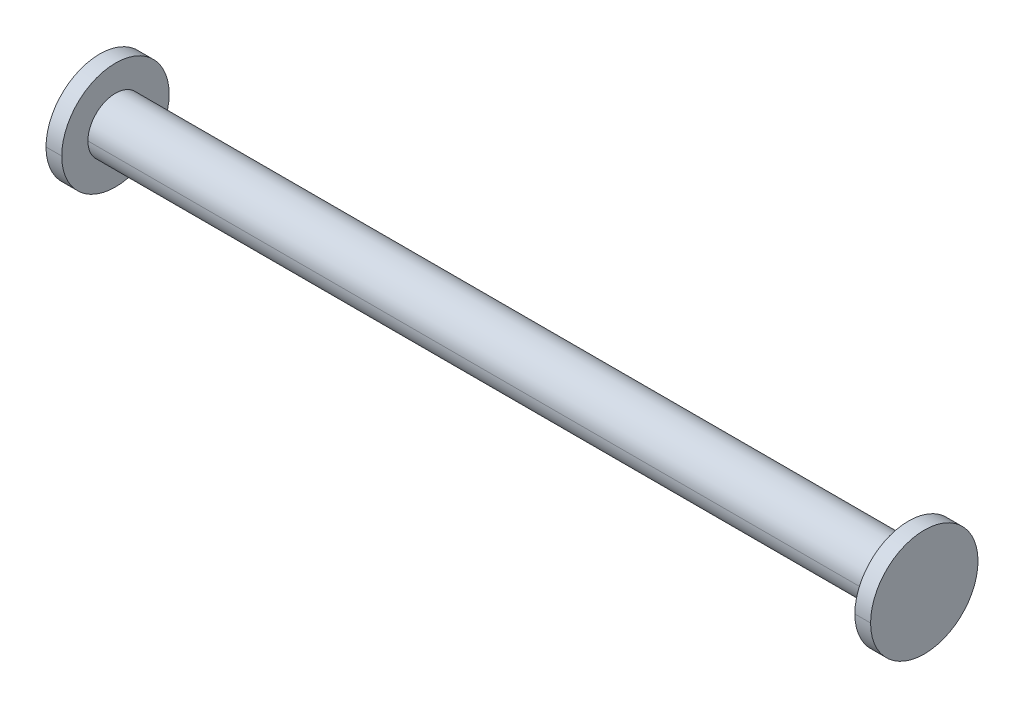
ISO-10303-21;
HEADER;
FILE_DESCRIPTION(('STEP AP214'),'2;1');
FILE_NAME('part.step','',(''),(''),'','','');
FILE_SCHEMA(('AUTOMOTIVE_DESIGN { 1 0 10303 214 1 1 1 1 }'));
ENDSEC;
DATA;
#1=APPLICATION_CONTEXT('core data for automotive mechanical design processes');
#2=APPLICATION_PROTOCOL_DEFINITION('international standard','automotive_design',2000,#1);
#3=PRODUCT_CONTEXT('',#1,'mechanical');
#4=PRODUCT('Part','Part','',(#3));
#5=PRODUCT_RELATED_PRODUCT_CATEGORY('part','',(#4));
#6=PRODUCT_DEFINITION_FORMATION('','',#4);
#7=PRODUCT_DEFINITION_CONTEXT('part definition',#1,'design');
#8=PRODUCT_DEFINITION('design','',#6,#7);
#9=PRODUCT_DEFINITION_SHAPE('','',#8);
#10=(LENGTH_UNIT() NAMED_UNIT(*) SI_UNIT(.MILLI.,.METRE.));
#11=(NAMED_UNIT(*) PLANE_ANGLE_UNIT() SI_UNIT($,.RADIAN.));
#12=(NAMED_UNIT(*) SI_UNIT($,.STERADIAN.) SOLID_ANGLE_UNIT());
#13=UNCERTAINTY_MEASURE_WITH_UNIT(LENGTH_MEASURE(1.E-05),#10,'distance_accuracy_value','');
#14=(GEOMETRIC_REPRESENTATION_CONTEXT(3) GLOBAL_UNCERTAINTY_ASSIGNED_CONTEXT((#13)) GLOBAL_UNIT_ASSIGNED_CONTEXT((#10,
#11,#12)) REPRESENTATION_CONTEXT('',''));
#15=CARTESIAN_POINT('',(0.,0.,0.));
#16=DIRECTION('',(0.,0.,1.));
#17=DIRECTION('',(1.,0.,0.));
#18=AXIS2_PLACEMENT_3D('',#15,#16,#17);
#19=CARTESIAN_POINT('',(59.4190666666667,0.,0.));
#20=DIRECTION('',(-1.,0.,0.));
#21=DIRECTION('',(0.,0.,1.));
#22=AXIS2_PLACEMENT_3D('',#19,#20,#21);
#23=PLANE('',#22);
#24=CARTESIAN_POINT('',(59.4190666666667,0.,0.));
#25=DIRECTION('',(1.,0.,0.));
#26=DIRECTION('',(0.,0.,-1.));
#27=AXIS2_PLACEMENT_3D('',#24,#25,#26);
#28=CIRCLE('',#27,7.73906249999998);
#29=CARTESIAN_POINT('',(59.4190666666667,0.,-7.73906249999998));
#30=VERTEX_POINT('',#29);
#31=CARTESIAN_POINT('',(59.4190666666667,0.,7.73906249999998));
#32=VERTEX_POINT('',#31);
#33=EDGE_CURVE('E139',#30,#32,#28,.T.);
#34=ORIENTED_EDGE('',*,*,#33,.T.);
#35=CARTESIAN_POINT('',(59.4190666666667,0.,0.));
#36=DIRECTION('',(1.,0.,0.));
#37=DIRECTION('',(0.,0.,-1.));
#38=AXIS2_PLACEMENT_3D('',#35,#36,#37);
#39=CIRCLE('',#38,7.73906249999998);
#40=EDGE_CURVE('E11',#32,#30,#39,.T.);
#41=ORIENTED_EDGE('',*,*,#40,.T.);
#42=EDGE_LOOP('',(#34,#41));
#43=FACE_BOUND('',#42,.T.);
#44=ADVANCED_FACE('F49',(#43),#23,.F.);
#45=CARTESIAN_POINT('',(24.5661814705045,0.,0.));
#46=DIRECTION('',(1.,0.,0.));
#47=DIRECTION('',(0.,0.,-1.));
#48=AXIS2_PLACEMENT_3D('',#45,#46,#47);
#49=CYLINDRICAL_SURFACE('',#48,7.73906249999999);
#50=DIRECTION('',(1.,0.,0.));
#51=VECTOR('',#50,1.);
#52=CARTESIAN_POINT('',(24.5661814705045,0.,7.73906249999999));
#53=LINE('',#52,#51);
#54=CARTESIAN_POINT('',(57.15,0.,7.73906249999999));
#55=VERTEX_POINT('',#54);
#56=EDGE_CURVE('E133',#55,#32,#53,.T.);
#57=ORIENTED_EDGE('',*,*,#56,.F.);
#58=CARTESIAN_POINT('',(57.15,0.,0.));
#59=DIRECTION('',(1.,0.,0.));
#60=DIRECTION('',(0.,0.,-1.));
#61=AXIS2_PLACEMENT_3D('',#58,#59,#60);
#62=CIRCLE('',#61,7.73906249999999);
#63=CARTESIAN_POINT('',(57.15,0.,-7.73906249999999));
#64=VERTEX_POINT('',#63);
#65=EDGE_CURVE('E58',#55,#64,#62,.T.);
#66=ORIENTED_EDGE('',*,*,#65,.T.);
#67=DIRECTION('',(1.,0.,0.));
#68=VECTOR('',#67,1.);
#69=CARTESIAN_POINT('',(24.5661814705045,0.,-7.73906249999999));
#70=LINE('',#69,#68);
#71=EDGE_CURVE('E142',#64,#30,#70,.T.);
#72=ORIENTED_EDGE('',*,*,#71,.T.);
#73=ORIENTED_EDGE('',*,*,#40,.F.);
#74=EDGE_LOOP('',(#57,#66,#72,#73));
#75=FACE_BOUND('',#74,.T.);
#76=ADVANCED_FACE('F134',(#75),#49,.T.);
#77=CARTESIAN_POINT('',(57.15,0.,0.));
#78=DIRECTION('',(1.,0.,0.));
#79=DIRECTION('',(0.,1.,0.));
#80=AXIS2_PLACEMENT_3D('',#77,#78,#79);
#81=PLANE('',#80);
#82=CARTESIAN_POINT('',(57.15,0.,0.));
#83=DIRECTION('',(1.,0.,0.));
#84=DIRECTION('',(0.,0.,-1.));
#85=AXIS2_PLACEMENT_3D('',#82,#83,#84);
#86=CIRCLE('',#85,3.96875);
#87=CARTESIAN_POINT('',(57.15,0.,-3.96875));
#88=VERTEX_POINT('',#87);
#89=CARTESIAN_POINT('',(57.15,0.,3.96875));
#90=VERTEX_POINT('',#89);
#91=EDGE_CURVE('E153',#88,#90,#86,.T.);
#92=ORIENTED_EDGE('',*,*,#91,.T.);
#93=CARTESIAN_POINT('',(57.15,0.,0.));
#94=DIRECTION('',(1.,0.,0.));
#95=DIRECTION('',(0.,0.,-1.));
#96=AXIS2_PLACEMENT_3D('',#93,#94,#95);
#97=CIRCLE('',#96,3.96875);
#98=EDGE_CURVE('E69',#90,#88,#97,.T.);
#99=ORIENTED_EDGE('',*,*,#98,.T.);
#100=EDGE_LOOP('',(#92,#99));
#101=FACE_BOUND('',#100,.T.);
#102=CARTESIAN_POINT('',(57.15,0.,0.));
#103=DIRECTION('',(1.,0.,0.));
#104=DIRECTION('',(0.,0.,-1.));
#105=AXIS2_PLACEMENT_3D('',#102,#103,#104);
#106=CIRCLE('',#105,7.73906249999999);
#107=EDGE_CURVE('E125',#64,#55,#106,.T.);
#108=ORIENTED_EDGE('',*,*,#107,.F.);
#109=ORIENTED_EDGE('',*,*,#65,.F.);
#110=EDGE_LOOP('',(#108,#109));
#111=FACE_BOUND('',#110,.T.);
#112=ADVANCED_FACE('F123',(#101,#111),#81,.F.);
#113=CARTESIAN_POINT('',(-59.4190666666667,0.,0.));
#114=DIRECTION('',(1.,0.,0.));
#115=DIRECTION('',(0.,1.,0.));
#116=AXIS2_PLACEMENT_3D('',#113,#114,#115);
#117=PLANE('',#116);
#118=CARTESIAN_POINT('',(-59.4190666666667,0.,0.));
#119=DIRECTION('',(1.,0.,0.));
#120=DIRECTION('',(0.,0.,-1.));
#121=AXIS2_PLACEMENT_3D('',#118,#119,#120);
#122=CIRCLE('',#121,7.7390625);
#123=CARTESIAN_POINT('',(-59.4190666666667,0.,-7.7390625));
#124=VERTEX_POINT('',#123);
#125=CARTESIAN_POINT('',(-59.4190666666667,0.,7.7390625));
#126=VERTEX_POINT('',#125);
#127=EDGE_CURVE('E169',#124,#126,#122,.T.);
#128=ORIENTED_EDGE('',*,*,#127,.F.);
#129=CARTESIAN_POINT('',(-59.4190666666667,0.,0.));
#130=DIRECTION('',(1.,0.,0.));
#131=DIRECTION('',(0.,0.,-1.));
#132=AXIS2_PLACEMENT_3D('',#129,#130,#131);
#133=CIRCLE('',#132,7.7390625);
#134=EDGE_CURVE('E130',#126,#124,#133,.T.);
#135=ORIENTED_EDGE('',*,*,#134,.F.);
#136=EDGE_LOOP('',(#128,#135));
#137=FACE_BOUND('',#136,.T.);
#138=ADVANCED_FACE('F242',(#137),#117,.F.);
#139=CARTESIAN_POINT('',(24.5661814705045,0.,0.));
#140=DIRECTION('',(1.,0.,0.));
#141=DIRECTION('',(0.,0.,-1.));
#142=AXIS2_PLACEMENT_3D('',#139,#140,#141);
#143=CYLINDRICAL_SURFACE('',#142,7.7390625);
#144=DIRECTION('',(1.,0.,0.));
#145=VECTOR('',#144,1.);
#146=CARTESIAN_POINT('',(24.5661814705045,0.,7.7390625));
#147=LINE('',#146,#145);
#148=CARTESIAN_POINT('',(-57.15,0.,7.7390625));
#149=VERTEX_POINT('',#148);
#150=EDGE_CURVE('E174',#126,#149,#147,.T.);
#151=ORIENTED_EDGE('',*,*,#150,.F.);
#152=ORIENTED_EDGE('',*,*,#134,.T.);
#153=DIRECTION('',(1.,0.,0.));
#154=VECTOR('',#153,1.);
#155=CARTESIAN_POINT('',(24.5661814705045,0.,-7.7390625));
#156=LINE('',#155,#154);
#157=CARTESIAN_POINT('',(-57.15,0.,-7.7390625));
#158=VERTEX_POINT('',#157);
#159=EDGE_CURVE('E160',#124,#158,#156,.T.);
#160=ORIENTED_EDGE('',*,*,#159,.T.);
#161=CARTESIAN_POINT('',(-57.15,0.,0.));
#162=DIRECTION('',(1.,0.,0.));
#163=DIRECTION('',(0.,0.,-1.));
#164=AXIS2_PLACEMENT_3D('',#161,#162,#163);
#165=CIRCLE('',#164,7.7390625);
#166=EDGE_CURVE('E151',#149,#158,#165,.T.);
#167=ORIENTED_EDGE('',*,*,#166,.F.);
#168=EDGE_LOOP('',(#151,#152,#160,#167));
#169=FACE_BOUND('',#168,.T.);
#170=ADVANCED_FACE('F246',(#169),#143,.T.);
#171=CARTESIAN_POINT('',(-57.15,0.,0.));
#172=DIRECTION('',(-1.,0.,0.));
#173=DIRECTION('',(0.,0.,1.));
#174=AXIS2_PLACEMENT_3D('',#171,#172,#173);
#175=PLANE('',#174);
#176=CARTESIAN_POINT('',(-57.15,0.,0.));
#177=DIRECTION('',(-1.,0.,0.));
#178=DIRECTION('',(0.,0.,1.));
#179=AXIS2_PLACEMENT_3D('',#176,#177,#178);
#180=CIRCLE('',#179,3.96875);
#181=CARTESIAN_POINT('',(-57.15,0.,-3.96875));
#182=VERTEX_POINT('',#181);
#183=CARTESIAN_POINT('',(-57.15,0.,3.96875));
#184=VERTEX_POINT('',#183);
#185=EDGE_CURVE('E88',#182,#184,#180,.T.);
#186=ORIENTED_EDGE('',*,*,#185,.T.);
#187=CARTESIAN_POINT('',(-57.15,0.,0.));
#188=DIRECTION('',(-1.,0.,0.));
#189=DIRECTION('',(0.,0.,1.));
#190=AXIS2_PLACEMENT_3D('',#187,#188,#189);
#191=CIRCLE('',#190,3.96875);
#192=EDGE_CURVE('E164',#184,#182,#191,.T.);
#193=ORIENTED_EDGE('',*,*,#192,.T.);
#194=EDGE_LOOP('',(#186,#193));
#195=FACE_BOUND('',#194,.T.);
#196=CARTESIAN_POINT('',(-57.15,0.,0.));
#197=DIRECTION('',(1.,0.,0.));
#198=DIRECTION('',(0.,0.,-1.));
#199=AXIS2_PLACEMENT_3D('',#196,#197,#198);
#200=CIRCLE('',#199,7.7390625);
#201=EDGE_CURVE('E165',#158,#149,#200,.T.);
#202=ORIENTED_EDGE('',*,*,#201,.T.);
#203=ORIENTED_EDGE('',*,*,#166,.T.);
#204=EDGE_LOOP('',(#202,#203));
#205=FACE_BOUND('',#204,.T.);
#206=ADVANCED_FACE('F252',(#195,#205),#175,.F.);
#207=CARTESIAN_POINT('',(24.5661814705045,0.,0.));
#208=DIRECTION('',(1.,0.,0.));
#209=DIRECTION('',(0.,0.,-1.));
#210=AXIS2_PLACEMENT_3D('',#207,#208,#209);
#211=CYLINDRICAL_SURFACE('',#210,3.96875);
#212=DIRECTION('',(1.,0.,0.));
#213=VECTOR('',#212,1.);
#214=CARTESIAN_POINT('',(24.5661814705045,0.,3.96875));
#215=LINE('',#214,#213);
#216=EDGE_CURVE('E156',#184,#90,#215,.T.);
#217=ORIENTED_EDGE('',*,*,#216,.F.);
#218=ORIENTED_EDGE('',*,*,#185,.F.);
#219=DIRECTION('',(1.,0.,0.));
#220=VECTOR('',#219,1.);
#221=CARTESIAN_POINT('',(24.5661814705045,0.,-3.96875));
#222=LINE('',#221,#220);
#223=EDGE_CURVE('E155',#182,#88,#222,.T.);
#224=ORIENTED_EDGE('',*,*,#223,.T.);
#225=ORIENTED_EDGE('',*,*,#98,.F.);
#226=EDGE_LOOP('',(#217,#218,#224,#225));
#227=FACE_BOUND('',#226,.T.);
#228=ADVANCED_FACE('F256',(#227),#211,.T.);
#229=CARTESIAN_POINT('',(24.5661814705045,0.,0.));
#230=DIRECTION('',(1.,0.,0.));
#231=DIRECTION('',(0.,0.,-1.));
#232=AXIS2_PLACEMENT_3D('',#229,#230,#231);
#233=CYLINDRICAL_SURFACE('',#232,3.96875);
#234=ORIENTED_EDGE('',*,*,#192,.F.);
#235=ORIENTED_EDGE('',*,*,#216,.T.);
#236=ORIENTED_EDGE('',*,*,#91,.F.);
#237=ORIENTED_EDGE('',*,*,#223,.F.);
#238=EDGE_LOOP('',(#234,#235,#236,#237));
#239=FACE_BOUND('',#238,.T.);
#240=ADVANCED_FACE('F272',(#239),#233,.T.);
#241=CARTESIAN_POINT('',(24.5661814705045,0.,0.));
#242=DIRECTION('',(1.,0.,0.));
#243=DIRECTION('',(0.,0.,-1.));
#244=AXIS2_PLACEMENT_3D('',#241,#242,#243);
#245=CYLINDRICAL_SURFACE('',#244,7.7390625);
#246=ORIENTED_EDGE('',*,*,#127,.T.);
#247=ORIENTED_EDGE('',*,*,#150,.T.);
#248=ORIENTED_EDGE('',*,*,#201,.F.);
#249=ORIENTED_EDGE('',*,*,#159,.F.);
#250=EDGE_LOOP('',(#246,#247,#248,#249));
#251=FACE_BOUND('',#250,.T.);
#252=ADVANCED_FACE('F264',(#251),#245,.T.);
#253=CARTESIAN_POINT('',(24.5661814705045,0.,0.));
#254=DIRECTION('',(1.,0.,0.));
#255=DIRECTION('',(0.,0.,-1.));
#256=AXIS2_PLACEMENT_3D('',#253,#254,#255);
#257=CYLINDRICAL_SURFACE('',#256,7.73906249999999);
#258=ORIENTED_EDGE('',*,*,#107,.T.);
#259=ORIENTED_EDGE('',*,*,#56,.T.);
#260=ORIENTED_EDGE('',*,*,#33,.F.);
#261=ORIENTED_EDGE('',*,*,#71,.F.);
#262=EDGE_LOOP('',(#258,#259,#260,#261));
#263=FACE_BOUND('',#262,.T.);
#264=ADVANCED_FACE('F141',(#263),#257,.T.);
#265=CLOSED_SHELL('',(#44,#76,#112,#138,#170,#206,#228,#240,#252,#264));
#266=MANIFOLD_SOLID_BREP('B2',#265);
#267=ADVANCED_BREP_SHAPE_REPRESENTATION('',(#18,#266),#14);
#268=SHAPE_DEFINITION_REPRESENTATION(#9,#267);
ENDSEC;
END-ISO-10303-21;
